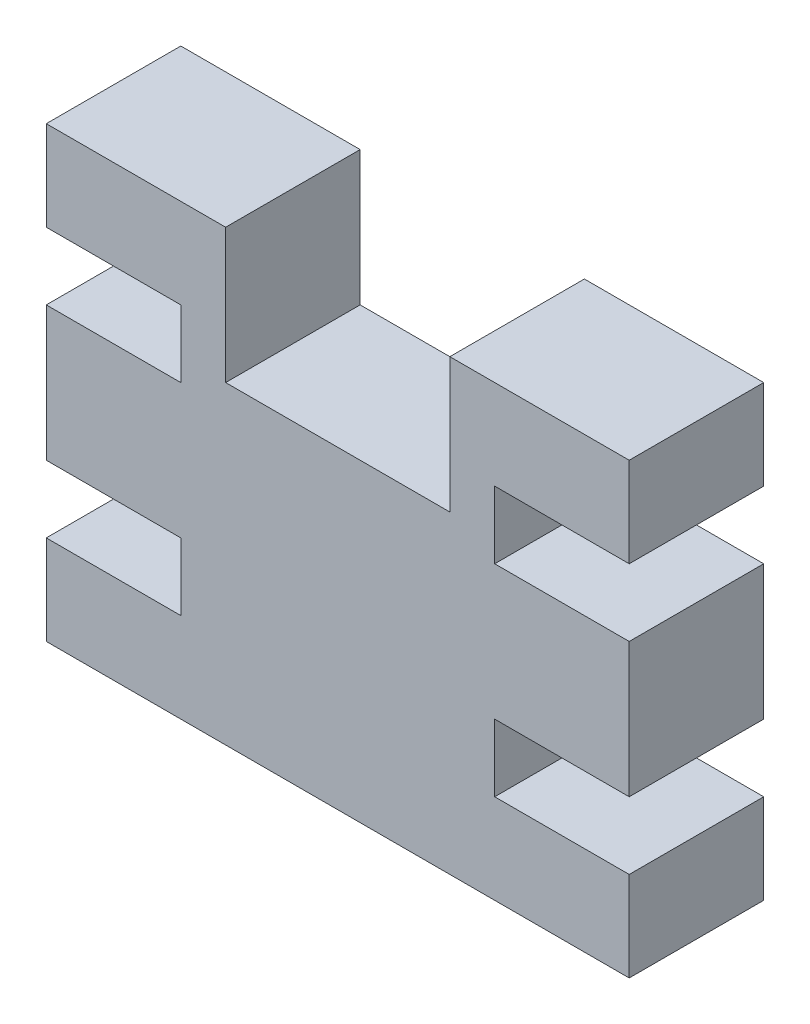
ISO-10303-21;
HEADER;
FILE_DESCRIPTION(('STEP AP214'),'2;1');
FILE_NAME('part.step','',(''),(''),'','','');
FILE_SCHEMA(('AUTOMOTIVE_DESIGN { 1 0 10303 214 1 1 1 1 }'));
ENDSEC;
DATA;
#1=APPLICATION_CONTEXT('core data for automotive mechanical design processes');
#2=APPLICATION_PROTOCOL_DEFINITION('international standard','automotive_design',2000,#1);
#3=PRODUCT_CONTEXT('',#1,'mechanical');
#4=PRODUCT('Part','Part','',(#3));
#5=PRODUCT_RELATED_PRODUCT_CATEGORY('part','',(#4));
#6=PRODUCT_DEFINITION_FORMATION('','',#4);
#7=PRODUCT_DEFINITION_CONTEXT('part definition',#1,'design');
#8=PRODUCT_DEFINITION('design','',#6,#7);
#9=PRODUCT_DEFINITION_SHAPE('','',#8);
#10=(LENGTH_UNIT() NAMED_UNIT(*) SI_UNIT(.MILLI.,.METRE.));
#11=(NAMED_UNIT(*) PLANE_ANGLE_UNIT() SI_UNIT($,.RADIAN.));
#12=(NAMED_UNIT(*) SI_UNIT($,.STERADIAN.) SOLID_ANGLE_UNIT());
#13=UNCERTAINTY_MEASURE_WITH_UNIT(LENGTH_MEASURE(1.E-05),#10,'distance_accuracy_value','');
#14=(GEOMETRIC_REPRESENTATION_CONTEXT(3) GLOBAL_UNCERTAINTY_ASSIGNED_CONTEXT((#13)) GLOBAL_UNIT_ASSIGNED_CONTEXT((#10,
#11,#12)) REPRESENTATION_CONTEXT('',''));
#15=CARTESIAN_POINT('',(0.,0.,0.));
#16=DIRECTION('',(0.,0.,1.));
#17=DIRECTION('',(1.,0.,0.));
#18=AXIS2_PLACEMENT_3D('',#15,#16,#17);
#19=CARTESIAN_POINT('',(6.5,14.6334586466165,3.));
#20=DIRECTION('',(0.,-1.,0.));
#21=DIRECTION('',(0.,0.,-1.));
#22=AXIS2_PLACEMENT_3D('',#19,#20,#21);
#23=PLANE('',#22);
#24=DIRECTION('',(-1.,0.,0.));
#25=VECTOR('',#24,1.);
#26=CARTESIAN_POINT('',(6.5,14.6334586466165,3.));
#27=LINE('',#26,#25);
#28=CARTESIAN_POINT('',(-2.5,14.6334586466165,3.));
#29=VERTEX_POINT('',#28);
#30=CARTESIAN_POINT('',(-6.5,14.6334586466165,3.));
#31=VERTEX_POINT('',#30);
#32=EDGE_CURVE('E348',#29,#31,#27,.T.);
#33=ORIENTED_EDGE('',*,*,#32,.F.);
#34=DIRECTION('',(0.,0.,1.));
#35=VECTOR('',#34,1.);
#36=CARTESIAN_POINT('',(-2.5,14.6334586466165,0.));
#37=LINE('',#36,#35);
#38=CARTESIAN_POINT('',(-2.5,14.6334586466165,0.));
#39=VERTEX_POINT('',#38);
#40=EDGE_CURVE('E228',#39,#29,#37,.T.);
#41=ORIENTED_EDGE('',*,*,#40,.F.);
#42=DIRECTION('',(-1.,0.,0.));
#43=VECTOR('',#42,1.);
#44=CARTESIAN_POINT('',(6.5,14.6334586466165,0.));
#45=LINE('',#44,#43);
#46=CARTESIAN_POINT('',(-6.5,14.6334586466165,0.));
#47=VERTEX_POINT('',#46);
#48=EDGE_CURVE('E219',#39,#47,#45,.T.);
#49=ORIENTED_EDGE('',*,*,#48,.T.);
#50=DIRECTION('',(0.,0.,-1.));
#51=VECTOR('',#50,1.);
#52=CARTESIAN_POINT('',(-6.5,14.6334586466165,3.));
#53=LINE('',#52,#51);
#54=EDGE_CURVE('E353',#31,#47,#53,.T.);
#55=ORIENTED_EDGE('',*,*,#54,.F.);
#56=EDGE_LOOP('',(#33,#41,#49,#55));
#57=FACE_BOUND('',#56,.T.);
#58=ADVANCED_FACE('F38',(#57),#23,.F.);
#59=CARTESIAN_POINT('',(6.5,4.63345864661654,3.));
#60=DIRECTION('',(-1.,0.,0.));
#61=DIRECTION('',(0.,0.,1.));
#62=AXIS2_PLACEMENT_3D('',#59,#60,#61);
#63=PLANE('',#62);
#64=DIRECTION('',(0.,1.,0.));
#65=VECTOR('',#64,1.);
#66=CARTESIAN_POINT('',(6.5,4.63345864661654,0.));
#67=LINE('',#66,#65);
#68=CARTESIAN_POINT('',(6.5,8.13345864661654,0.));
#69=VERTEX_POINT('',#68);
#70=CARTESIAN_POINT('',(6.5,11.1334586466165,0.));
#71=VERTEX_POINT('',#70);
#72=EDGE_CURVE('E364',#69,#71,#67,.T.);
#73=ORIENTED_EDGE('',*,*,#72,.T.);
#74=DIRECTION('',(0.,0.,1.));
#75=VECTOR('',#74,1.);
#76=CARTESIAN_POINT('',(6.5,11.1334586466165,0.));
#77=LINE('',#76,#75);
#78=CARTESIAN_POINT('',(6.5,11.1334586466165,3.));
#79=VERTEX_POINT('',#78);
#80=EDGE_CURVE('E252',#71,#79,#77,.T.);
#81=ORIENTED_EDGE('',*,*,#80,.T.);
#82=DIRECTION('',(0.,1.,0.));
#83=VECTOR('',#82,1.);
#84=CARTESIAN_POINT('',(6.5,4.63345864661654,3.));
#85=LINE('',#84,#83);
#86=CARTESIAN_POINT('',(6.5,8.13345864661654,3.));
#87=VERTEX_POINT('',#86);
#88=EDGE_CURVE('E349',#87,#79,#85,.T.);
#89=ORIENTED_EDGE('',*,*,#88,.F.);
#90=DIRECTION('',(0.,0.,1.));
#91=VECTOR('',#90,1.);
#92=CARTESIAN_POINT('',(6.5,8.13345864661654,0.));
#93=LINE('',#92,#91);
#94=EDGE_CURVE('E261',#69,#87,#93,.T.);
#95=ORIENTED_EDGE('',*,*,#94,.F.);
#96=EDGE_LOOP('',(#73,#81,#89,#95));
#97=FACE_BOUND('',#96,.T.);
#98=ADVANCED_FACE('F437',(#97),#63,.F.);
#99=CARTESIAN_POINT('',(6.5,4.63345864661654,0.));
#100=VERTEX_POINT('',#99);
#101=CARTESIAN_POINT('',(6.5,6.63345864661654,0.));
#102=VERTEX_POINT('',#101);
#103=EDGE_CURVE('E361',#100,#102,#67,.T.);
#104=ORIENTED_EDGE('',*,*,#103,.T.);
#105=DIRECTION('',(0.,0.,1.));
#106=VECTOR('',#105,1.);
#107=CARTESIAN_POINT('',(6.5,6.63345864661654,0.));
#108=LINE('',#107,#106);
#109=CARTESIAN_POINT('',(6.5,6.63345864661654,3.));
#110=VERTEX_POINT('',#109);
#111=EDGE_CURVE('E230',#102,#110,#108,.T.);
#112=ORIENTED_EDGE('',*,*,#111,.T.);
#113=CARTESIAN_POINT('',(6.5,4.63345864661654,3.));
#114=VERTEX_POINT('',#113);
#115=EDGE_CURVE('E345',#114,#110,#85,.T.);
#116=ORIENTED_EDGE('',*,*,#115,.F.);
#117=DIRECTION('',(0.,0.,-1.));
#118=VECTOR('',#117,1.);
#119=CARTESIAN_POINT('',(6.5,4.63345864661654,3.));
#120=LINE('',#119,#118);
#121=EDGE_CURVE('E46',#114,#100,#120,.T.);
#122=ORIENTED_EDGE('',*,*,#121,.T.);
#123=EDGE_LOOP('',(#104,#112,#116,#122));
#124=FACE_BOUND('',#123,.T.);
#125=ADVANCED_FACE('F377',(#124),#63,.F.);
#126=CARTESIAN_POINT('',(-6.5,4.63345864661654,3.));
#127=DIRECTION('',(1.,0.,0.));
#128=DIRECTION('',(0.,0.,-1.));
#129=AXIS2_PLACEMENT_3D('',#126,#127,#128);
#130=PLANE('',#129);
#131=DIRECTION('',(0.,-1.,0.));
#132=VECTOR('',#131,1.);
#133=CARTESIAN_POINT('',(-6.5,4.63345864661654,0.));
#134=LINE('',#133,#132);
#135=CARTESIAN_POINT('',(-6.5,12.6334586466165,0.));
#136=VERTEX_POINT('',#135);
#137=EDGE_CURVE('E354',#47,#136,#134,.T.);
#138=ORIENTED_EDGE('',*,*,#137,.T.);
#139=DIRECTION('',(0.,0.,1.));
#140=VECTOR('',#139,1.);
#141=CARTESIAN_POINT('',(-6.5,12.6334586466165,0.));
#142=LINE('',#141,#140);
#143=CARTESIAN_POINT('',(-6.5,12.6334586466165,3.));
#144=VERTEX_POINT('',#143);
#145=EDGE_CURVE('E304',#136,#144,#142,.T.);
#146=ORIENTED_EDGE('',*,*,#145,.T.);
#147=DIRECTION('',(0.,-1.,0.));
#148=VECTOR('',#147,1.);
#149=CARTESIAN_POINT('',(-6.5,4.63345864661654,3.));
#150=LINE('',#149,#148);
#151=EDGE_CURVE('E337',#31,#144,#150,.T.);
#152=ORIENTED_EDGE('',*,*,#151,.F.);
#153=ORIENTED_EDGE('',*,*,#54,.T.);
#154=EDGE_LOOP('',(#138,#146,#152,#153));
#155=FACE_BOUND('',#154,.T.);
#156=ADVANCED_FACE('F418',(#155),#130,.F.);
#157=CARTESIAN_POINT('',(-6.5,11.1334586466165,3.));
#158=VERTEX_POINT('',#157);
#159=CARTESIAN_POINT('',(-6.5,8.13345864661654,3.));
#160=VERTEX_POINT('',#159);
#161=EDGE_CURVE('E341',#158,#160,#150,.T.);
#162=ORIENTED_EDGE('',*,*,#161,.F.);
#163=DIRECTION('',(0.,0.,1.));
#164=VECTOR('',#163,1.);
#165=CARTESIAN_POINT('',(-6.5,11.1334586466165,0.));
#166=LINE('',#165,#164);
#167=CARTESIAN_POINT('',(-6.5,11.1334586466165,0.));
#168=VERTEX_POINT('',#167);
#169=EDGE_CURVE('E295',#168,#158,#166,.T.);
#170=ORIENTED_EDGE('',*,*,#169,.F.);
#171=CARTESIAN_POINT('',(-6.5,8.13345864661654,0.));
#172=VERTEX_POINT('',#171);
#173=EDGE_CURVE('E358',#168,#172,#134,.T.);
#174=ORIENTED_EDGE('',*,*,#173,.T.);
#175=DIRECTION('',(0.,0.,1.));
#176=VECTOR('',#175,1.);
#177=CARTESIAN_POINT('',(-6.5,8.13345864661654,0.));
#178=LINE('',#177,#176);
#179=EDGE_CURVE('E255',#172,#160,#178,.T.);
#180=ORIENTED_EDGE('',*,*,#179,.T.);
#181=EDGE_LOOP('',(#162,#170,#174,#180));
#182=FACE_BOUND('',#181,.T.);
#183=ADVANCED_FACE('F400',(#182),#130,.F.);
#184=CARTESIAN_POINT('',(-6.5,6.63345864661654,3.));
#185=VERTEX_POINT('',#184);
#186=CARTESIAN_POINT('',(-6.5,4.63345864661654,3.));
#187=VERTEX_POINT('',#186);
#188=EDGE_CURVE('E342',#185,#187,#150,.T.);
#189=ORIENTED_EDGE('',*,*,#188,.F.);
#190=DIRECTION('',(0.,0.,1.));
#191=VECTOR('',#190,1.);
#192=CARTESIAN_POINT('',(-6.5,6.63345864661654,0.));
#193=LINE('',#192,#191);
#194=CARTESIAN_POINT('',(-6.5,6.63345864661654,0.));
#195=VERTEX_POINT('',#194);
#196=EDGE_CURVE('E313',#195,#185,#193,.T.);
#197=ORIENTED_EDGE('',*,*,#196,.F.);
#198=CARTESIAN_POINT('',(-6.5,4.63345864661654,0.));
#199=VERTEX_POINT('',#198);
#200=EDGE_CURVE('E307',#195,#199,#134,.T.);
#201=ORIENTED_EDGE('',*,*,#200,.T.);
#202=DIRECTION('',(0.,0.,-1.));
#203=VECTOR('',#202,1.);
#204=CARTESIAN_POINT('',(-6.5,4.63345864661654,3.));
#205=LINE('',#204,#203);
#206=EDGE_CURVE('E11',#187,#199,#205,.T.);
#207=ORIENTED_EDGE('',*,*,#206,.F.);
#208=EDGE_LOOP('',(#189,#197,#201,#207));
#209=FACE_BOUND('',#208,.T.);
#210=ADVANCED_FACE('F40',(#209),#130,.F.);
#211=CARTESIAN_POINT('',(6.5,4.63345864661654,3.));
#212=DIRECTION('',(0.,1.,0.));
#213=DIRECTION('',(-1.,0.,0.));
#214=AXIS2_PLACEMENT_3D('',#211,#212,#213);
#215=PLANE('',#214);
#216=DIRECTION('',(1.,0.,0.));
#217=VECTOR('',#216,1.);
#218=CARTESIAN_POINT('',(6.5,4.63345864661654,0.));
#219=LINE('',#218,#217);
#220=EDGE_CURVE('E357',#199,#100,#219,.T.);
#221=ORIENTED_EDGE('',*,*,#220,.T.);
#222=ORIENTED_EDGE('',*,*,#121,.F.);
#223=DIRECTION('',(1.,0.,0.));
#224=VECTOR('',#223,1.);
#225=CARTESIAN_POINT('',(6.5,4.63345864661654,3.));
#226=LINE('',#225,#224);
#227=EDGE_CURVE('E340',#187,#114,#226,.T.);
#228=ORIENTED_EDGE('',*,*,#227,.F.);
#229=ORIENTED_EDGE('',*,*,#206,.T.);
#230=EDGE_LOOP('',(#221,#222,#228,#229));
#231=FACE_BOUND('',#230,.T.);
#232=ADVANCED_FACE('F392',(#231),#215,.F.);
#233=CARTESIAN_POINT('',(6.5,12.6334586466165,3.));
#234=VERTEX_POINT('',#233);
#235=CARTESIAN_POINT('',(6.5,14.6334586466165,3.));
#236=VERTEX_POINT('',#235);
#237=EDGE_CURVE('E344',#234,#236,#85,.T.);
#238=ORIENTED_EDGE('',*,*,#237,.F.);
#239=DIRECTION('',(0.,0.,1.));
#240=VECTOR('',#239,1.);
#241=CARTESIAN_POINT('',(6.5,12.6334586466165,0.));
#242=LINE('',#241,#240);
#243=CARTESIAN_POINT('',(6.5,12.6334586466165,0.));
#244=VERTEX_POINT('',#243);
#245=EDGE_CURVE('E243',#244,#234,#242,.T.);
#246=ORIENTED_EDGE('',*,*,#245,.F.);
#247=CARTESIAN_POINT('',(6.5,14.6334586466165,0.));
#248=VERTEX_POINT('',#247);
#249=EDGE_CURVE('E360',#244,#248,#67,.T.);
#250=ORIENTED_EDGE('',*,*,#249,.T.);
#251=DIRECTION('',(0.,0.,-1.));
#252=VECTOR('',#251,1.);
#253=CARTESIAN_POINT('',(6.5,14.6334586466165,3.));
#254=LINE('',#253,#252);
#255=EDGE_CURVE('E370',#236,#248,#254,.T.);
#256=ORIENTED_EDGE('',*,*,#255,.F.);
#257=EDGE_LOOP('',(#238,#246,#250,#256));
#258=FACE_BOUND('',#257,.T.);
#259=ADVANCED_FACE('F448',(#258),#63,.F.);
#260=CARTESIAN_POINT('',(2.5,14.6334586466165,0.));
#261=VERTEX_POINT('',#260);
#262=EDGE_CURVE('E365',#248,#261,#45,.T.);
#263=ORIENTED_EDGE('',*,*,#262,.T.);
#264=DIRECTION('',(0.,0.,1.));
#265=VECTOR('',#264,1.);
#266=CARTESIAN_POINT('',(2.5,14.6334586466165,0.));
#267=LINE('',#266,#265);
#268=CARTESIAN_POINT('',(2.5,14.6334586466165,3.));
#269=VERTEX_POINT('',#268);
#270=EDGE_CURVE('E231',#261,#269,#267,.T.);
#271=ORIENTED_EDGE('',*,*,#270,.T.);
#272=EDGE_CURVE('E350',#236,#269,#27,.T.);
#273=ORIENTED_EDGE('',*,*,#272,.F.);
#274=ORIENTED_EDGE('',*,*,#255,.T.);
#275=EDGE_LOOP('',(#263,#271,#273,#274));
#276=FACE_BOUND('',#275,.T.);
#277=ADVANCED_FACE('F427',(#276),#23,.F.);
#278=CARTESIAN_POINT('',(0.,0.,3.));
#279=DIRECTION('',(0.,0.,1.));
#280=DIRECTION('',(1.,0.,0.));
#281=AXIS2_PLACEMENT_3D('',#278,#279,#280);
#282=PLANE('',#281);
#283=DIRECTION('',(0.,-1.,0.));
#284=VECTOR('',#283,1.);
#285=CARTESIAN_POINT('',(-2.5,14.6334586466165,3.));
#286=LINE('',#285,#284);
#287=CARTESIAN_POINT('',(-2.5,11.6334586466165,3.));
#288=VERTEX_POINT('',#287);
#289=EDGE_CURVE('E205',#29,#288,#286,.T.);
#290=ORIENTED_EDGE('',*,*,#289,.F.);
#291=ORIENTED_EDGE('',*,*,#32,.T.);
#292=ORIENTED_EDGE('',*,*,#151,.T.);
#293=DIRECTION('',(-1.,0.,0.));
#294=VECTOR('',#293,1.);
#295=CARTESIAN_POINT('',(-6.5,12.6334586466165,3.));
#296=LINE('',#295,#294);
#297=CARTESIAN_POINT('',(-3.5,12.6334586466165,3.));
#298=VERTEX_POINT('',#297);
#299=EDGE_CURVE('E289',#298,#144,#296,.T.);
#300=ORIENTED_EDGE('',*,*,#299,.F.);
#301=DIRECTION('',(0.,1.,0.));
#302=VECTOR('',#301,1.);
#303=CARTESIAN_POINT('',(-3.5,12.6334586466165,3.));
#304=LINE('',#303,#302);
#305=CARTESIAN_POINT('',(-3.5,11.1334586466165,3.));
#306=VERTEX_POINT('',#305);
#307=EDGE_CURVE('E299',#306,#298,#304,.T.);
#308=ORIENTED_EDGE('',*,*,#307,.F.);
#309=DIRECTION('',(1.,0.,0.));
#310=VECTOR('',#309,1.);
#311=CARTESIAN_POINT('',(-6.5,11.1334586466165,3.));
#312=LINE('',#311,#310);
#313=EDGE_CURVE('E296',#158,#306,#312,.T.);
#314=ORIENTED_EDGE('',*,*,#313,.F.);
#315=ORIENTED_EDGE('',*,*,#161,.T.);
#316=DIRECTION('',(-1.,0.,0.));
#317=VECTOR('',#316,1.);
#318=CARTESIAN_POINT('',(-6.5,8.13345864661654,3.));
#319=LINE('',#318,#317);
#320=CARTESIAN_POINT('',(-3.5,8.13345864661654,3.));
#321=VERTEX_POINT('',#320);
#322=EDGE_CURVE('E322',#321,#160,#319,.T.);
#323=ORIENTED_EDGE('',*,*,#322,.F.);
#324=DIRECTION('',(0.,1.,0.));
#325=VECTOR('',#324,1.);
#326=CARTESIAN_POINT('',(-3.5,8.13345864661654,3.));
#327=LINE('',#326,#325);
#328=CARTESIAN_POINT('',(-3.5,6.63345864661654,3.));
#329=VERTEX_POINT('',#328);
#330=EDGE_CURVE('E324',#329,#321,#327,.T.);
#331=ORIENTED_EDGE('',*,*,#330,.F.);
#332=DIRECTION('',(1.,0.,0.));
#333=VECTOR('',#332,1.);
#334=CARTESIAN_POINT('',(-6.5,6.63345864661654,3.));
#335=LINE('',#334,#333);
#336=EDGE_CURVE('E300',#185,#329,#335,.T.);
#337=ORIENTED_EDGE('',*,*,#336,.F.);
#338=ORIENTED_EDGE('',*,*,#188,.T.);
#339=ORIENTED_EDGE('',*,*,#227,.T.);
#340=ORIENTED_EDGE('',*,*,#115,.T.);
#341=DIRECTION('',(1.,0.,0.));
#342=VECTOR('',#341,1.);
#343=CARTESIAN_POINT('',(6.5,6.63345864661654,3.));
#344=LINE('',#343,#342);
#345=CARTESIAN_POINT('',(3.5,6.63345864661654,3.));
#346=VERTEX_POINT('',#345);
#347=EDGE_CURVE('E270',#346,#110,#344,.T.);
#348=ORIENTED_EDGE('',*,*,#347,.F.);
#349=DIRECTION('',(0.,-1.,0.));
#350=VECTOR('',#349,1.);
#351=CARTESIAN_POINT('',(3.5,8.13345864661654,3.));
#352=LINE('',#351,#350);
#353=CARTESIAN_POINT('',(3.5,8.13345864661654,3.));
#354=VERTEX_POINT('',#353);
#355=EDGE_CURVE('E272',#354,#346,#352,.T.);
#356=ORIENTED_EDGE('',*,*,#355,.F.);
#357=DIRECTION('',(-1.,0.,0.));
#358=VECTOR('',#357,1.);
#359=CARTESIAN_POINT('',(6.5,8.13345864661654,3.));
#360=LINE('',#359,#358);
#361=EDGE_CURVE('E248',#87,#354,#360,.T.);
#362=ORIENTED_EDGE('',*,*,#361,.F.);
#363=ORIENTED_EDGE('',*,*,#88,.T.);
#364=DIRECTION('',(1.,0.,0.));
#365=VECTOR('',#364,1.);
#366=CARTESIAN_POINT('',(6.5,11.1334586466165,3.));
#367=LINE('',#366,#365);
#368=CARTESIAN_POINT('',(3.5,11.1334586466165,3.));
#369=VERTEX_POINT('',#368);
#370=EDGE_CURVE('E238',#369,#79,#367,.T.);
#371=ORIENTED_EDGE('',*,*,#370,.F.);
#372=DIRECTION('',(0.,-1.,0.));
#373=VECTOR('',#372,1.);
#374=CARTESIAN_POINT('',(3.5,12.6334586466165,3.));
#375=LINE('',#374,#373);
#376=CARTESIAN_POINT('',(3.5,12.6334586466165,3.));
#377=VERTEX_POINT('',#376);
#378=EDGE_CURVE('E247',#377,#369,#375,.T.);
#379=ORIENTED_EDGE('',*,*,#378,.F.);
#380=DIRECTION('',(-1.,0.,0.));
#381=VECTOR('',#380,1.);
#382=CARTESIAN_POINT('',(6.5,12.6334586466165,3.));
#383=LINE('',#382,#381);
#384=EDGE_CURVE('E244',#234,#377,#383,.T.);
#385=ORIENTED_EDGE('',*,*,#384,.F.);
#386=ORIENTED_EDGE('',*,*,#237,.T.);
#387=ORIENTED_EDGE('',*,*,#272,.T.);
#388=DIRECTION('',(0.,1.,0.));
#389=VECTOR('',#388,1.);
#390=CARTESIAN_POINT('',(2.5,14.6334586466165,3.));
#391=LINE('',#390,#389);
#392=CARTESIAN_POINT('',(2.5,11.6334586466165,3.));
#393=VERTEX_POINT('',#392);
#394=EDGE_CURVE('E220',#393,#269,#391,.T.);
#395=ORIENTED_EDGE('',*,*,#394,.F.);
#396=DIRECTION('',(1.,0.,0.));
#397=VECTOR('',#396,1.);
#398=CARTESIAN_POINT('',(-2.5,11.6334586466165,3.));
#399=LINE('',#398,#397);
#400=EDGE_CURVE('E222',#288,#393,#399,.T.);
#401=ORIENTED_EDGE('',*,*,#400,.F.);
#402=EDGE_LOOP('',(#290,#291,#292,#300,#308,#314,#315,#323,#331,#337,#338,#339,#340,#348,#356,
#362,#363,#371,#379,#385,#386,#387,#395,#401));
#403=FACE_BOUND('',#402,.T.);
#404=ADVANCED_FACE('F387',(#403),#282,.T.);
#405=CARTESIAN_POINT('',(0.,0.,0.));
#406=DIRECTION('',(0.,0.,1.));
#407=DIRECTION('',(1.,0.,0.));
#408=AXIS2_PLACEMENT_3D('',#405,#406,#407);
#409=PLANE('',#408);
#410=ORIENTED_EDGE('',*,*,#48,.F.);
#411=DIRECTION('',(0.,-1.,0.));
#412=VECTOR('',#411,1.);
#413=CARTESIAN_POINT('',(-2.5,14.6334586466165,0.));
#414=LINE('',#413,#412);
#415=CARTESIAN_POINT('',(-2.5,11.6334586466165,0.));
#416=VERTEX_POINT('',#415);
#417=EDGE_CURVE('E202',#39,#416,#414,.T.);
#418=ORIENTED_EDGE('',*,*,#417,.T.);
#419=DIRECTION('',(1.,0.,0.));
#420=VECTOR('',#419,1.);
#421=CARTESIAN_POINT('',(-2.5,11.6334586466165,0.));
#422=LINE('',#421,#420);
#423=CARTESIAN_POINT('',(2.5,11.6334586466165,0.));
#424=VERTEX_POINT('',#423);
#425=EDGE_CURVE('E212',#416,#424,#422,.T.);
#426=ORIENTED_EDGE('',*,*,#425,.T.);
#427=DIRECTION('',(0.,1.,0.));
#428=VECTOR('',#427,1.);
#429=CARTESIAN_POINT('',(2.5,14.6334586466165,0.));
#430=LINE('',#429,#428);
#431=EDGE_CURVE('E53',#424,#261,#430,.T.);
#432=ORIENTED_EDGE('',*,*,#431,.T.);
#433=ORIENTED_EDGE('',*,*,#262,.F.);
#434=ORIENTED_EDGE('',*,*,#249,.F.);
#435=DIRECTION('',(-1.,0.,0.));
#436=VECTOR('',#435,1.);
#437=CARTESIAN_POINT('',(6.5,12.6334586466165,0.));
#438=LINE('',#437,#436);
#439=CARTESIAN_POINT('',(3.5,12.6334586466165,0.));
#440=VERTEX_POINT('',#439);
#441=EDGE_CURVE('E235',#244,#440,#438,.T.);
#442=ORIENTED_EDGE('',*,*,#441,.T.);
#443=DIRECTION('',(0.,-1.,0.));
#444=VECTOR('',#443,1.);
#445=CARTESIAN_POINT('',(3.5,12.6334586466165,0.));
#446=LINE('',#445,#444);
#447=CARTESIAN_POINT('',(3.5,11.1334586466165,0.));
#448=VERTEX_POINT('',#447);
#449=EDGE_CURVE('E61',#440,#448,#446,.T.);
#450=ORIENTED_EDGE('',*,*,#449,.T.);
#451=DIRECTION('',(1.,0.,0.));
#452=VECTOR('',#451,1.);
#453=CARTESIAN_POINT('',(6.5,11.1334586466165,0.));
#454=LINE('',#453,#452);
#455=EDGE_CURVE('E240',#448,#71,#454,.T.);
#456=ORIENTED_EDGE('',*,*,#455,.T.);
#457=ORIENTED_EDGE('',*,*,#72,.F.);
#458=DIRECTION('',(-1.,0.,0.));
#459=VECTOR('',#458,1.);
#460=CARTESIAN_POINT('',(6.5,8.13345864661654,0.));
#461=LINE('',#460,#459);
#462=CARTESIAN_POINT('',(3.5,8.13345864661654,0.));
#463=VERTEX_POINT('',#462);
#464=EDGE_CURVE('E273',#69,#463,#461,.T.);
#465=ORIENTED_EDGE('',*,*,#464,.T.);
#466=DIRECTION('',(0.,-1.,0.));
#467=VECTOR('',#466,1.);
#468=CARTESIAN_POINT('',(3.5,8.13345864661654,0.));
#469=LINE('',#468,#467);
#470=CARTESIAN_POINT('',(3.5,6.63345864661654,0.));
#471=VERTEX_POINT('',#470);
#472=EDGE_CURVE('E280',#463,#471,#469,.T.);
#473=ORIENTED_EDGE('',*,*,#472,.T.);
#474=DIRECTION('',(1.,0.,0.));
#475=VECTOR('',#474,1.);
#476=CARTESIAN_POINT('',(6.5,6.63345864661654,0.));
#477=LINE('',#476,#475);
#478=EDGE_CURVE('E263',#471,#102,#477,.T.);
#479=ORIENTED_EDGE('',*,*,#478,.T.);
#480=ORIENTED_EDGE('',*,*,#103,.F.);
#481=ORIENTED_EDGE('',*,*,#220,.F.);
#482=ORIENTED_EDGE('',*,*,#200,.F.);
#483=DIRECTION('',(1.,0.,0.));
#484=VECTOR('',#483,1.);
#485=CARTESIAN_POINT('',(-6.5,6.63345864661654,0.));
#486=LINE('',#485,#484);
#487=CARTESIAN_POINT('',(-3.5,6.63345864661654,0.));
#488=VERTEX_POINT('',#487);
#489=EDGE_CURVE('E325',#195,#488,#486,.T.);
#490=ORIENTED_EDGE('',*,*,#489,.T.);
#491=DIRECTION('',(0.,1.,0.));
#492=VECTOR('',#491,1.);
#493=CARTESIAN_POINT('',(-3.5,8.13345864661654,0.));
#494=LINE('',#493,#492);
#495=CARTESIAN_POINT('',(-3.5,8.13345864661654,0.));
#496=VERTEX_POINT('',#495);
#497=EDGE_CURVE('E332',#488,#496,#494,.T.);
#498=ORIENTED_EDGE('',*,*,#497,.T.);
#499=DIRECTION('',(-1.,0.,0.));
#500=VECTOR('',#499,1.);
#501=CARTESIAN_POINT('',(-6.5,8.13345864661654,0.));
#502=LINE('',#501,#500);
#503=EDGE_CURVE('E315',#496,#172,#502,.T.);
#504=ORIENTED_EDGE('',*,*,#503,.T.);
#505=ORIENTED_EDGE('',*,*,#173,.F.);
#506=DIRECTION('',(1.,0.,0.));
#507=VECTOR('',#506,1.);
#508=CARTESIAN_POINT('',(-6.5,11.1334586466165,0.));
#509=LINE('',#508,#507);
#510=CARTESIAN_POINT('',(-3.5,11.1334586466165,0.));
#511=VERTEX_POINT('',#510);
#512=EDGE_CURVE('E285',#168,#511,#509,.T.);
#513=ORIENTED_EDGE('',*,*,#512,.T.);
#514=DIRECTION('',(0.,1.,0.));
#515=VECTOR('',#514,1.);
#516=CARTESIAN_POINT('',(-3.5,12.6334586466165,0.));
#517=LINE('',#516,#515);
#518=CARTESIAN_POINT('',(-3.5,12.6334586466165,0.));
#519=VERTEX_POINT('',#518);
#520=EDGE_CURVE('E288',#511,#519,#517,.T.);
#521=ORIENTED_EDGE('',*,*,#520,.T.);
#522=DIRECTION('',(-1.,0.,0.));
#523=VECTOR('',#522,1.);
#524=CARTESIAN_POINT('',(-6.5,12.6334586466165,0.));
#525=LINE('',#524,#523);
#526=EDGE_CURVE('E292',#519,#136,#525,.T.);
#527=ORIENTED_EDGE('',*,*,#526,.T.);
#528=ORIENTED_EDGE('',*,*,#137,.F.);
#529=EDGE_LOOP('',(#410,#418,#426,#432,#433,#434,#442,#450,#456,#457,#465,#473,#479,#480,#481,
#482,#490,#498,#504,#505,#513,#521,#527,#528));
#530=FACE_BOUND('',#529,.T.);
#531=ADVANCED_FACE('F217',(#530),#409,.F.);
#532=CARTESIAN_POINT('',(-6.5,8.13345864661654,0.));
#533=DIRECTION('',(0.,1.,0.));
#534=DIRECTION('',(0.,0.,1.));
#535=AXIS2_PLACEMENT_3D('',#532,#533,#534);
#536=PLANE('',#535);
#537=ORIENTED_EDGE('',*,*,#322,.T.);
#538=ORIENTED_EDGE('',*,*,#179,.F.);
#539=ORIENTED_EDGE('',*,*,#503,.F.);
#540=DIRECTION('',(0.,0.,1.));
#541=VECTOR('',#540,1.);
#542=CARTESIAN_POINT('',(-3.5,8.13345864661654,0.));
#543=LINE('',#542,#541);
#544=EDGE_CURVE('E318',#496,#321,#543,.T.);
#545=ORIENTED_EDGE('',*,*,#544,.T.);
#546=EDGE_LOOP('',(#537,#538,#539,#545));
#547=FACE_BOUND('',#546,.T.);
#548=ADVANCED_FACE('F404',(#547),#536,.F.);
#549=CARTESIAN_POINT('',(-3.5,8.13345864661654,0.));
#550=DIRECTION('',(1.,0.,0.));
#551=DIRECTION('',(0.,1.,0.));
#552=AXIS2_PLACEMENT_3D('',#549,#550,#551);
#553=PLANE('',#552);
#554=ORIENTED_EDGE('',*,*,#330,.T.);
#555=ORIENTED_EDGE('',*,*,#544,.F.);
#556=ORIENTED_EDGE('',*,*,#497,.F.);
#557=DIRECTION('',(0.,0.,1.));
#558=VECTOR('',#557,1.);
#559=CARTESIAN_POINT('',(-3.5,6.63345864661654,0.));
#560=LINE('',#559,#558);
#561=EDGE_CURVE('E316',#488,#329,#560,.T.);
#562=ORIENTED_EDGE('',*,*,#561,.T.);
#563=EDGE_LOOP('',(#554,#555,#556,#562));
#564=FACE_BOUND('',#563,.T.);
#565=ADVANCED_FACE('F470',(#564),#553,.F.);
#566=CARTESIAN_POINT('',(-6.5,6.63345864661654,0.));
#567=DIRECTION('',(0.,-1.,0.));
#568=DIRECTION('',(0.,0.,-1.));
#569=AXIS2_PLACEMENT_3D('',#566,#567,#568);
#570=PLANE('',#569);
#571=ORIENTED_EDGE('',*,*,#336,.T.);
#572=ORIENTED_EDGE('',*,*,#561,.F.);
#573=ORIENTED_EDGE('',*,*,#489,.F.);
#574=ORIENTED_EDGE('',*,*,#196,.T.);
#575=EDGE_LOOP('',(#571,#572,#573,#574));
#576=FACE_BOUND('',#575,.T.);
#577=ADVANCED_FACE('F473',(#576),#570,.F.);
#578=CARTESIAN_POINT('',(-6.5,12.6334586466165,0.));
#579=DIRECTION('',(0.,1.,0.));
#580=DIRECTION('',(0.,0.,1.));
#581=AXIS2_PLACEMENT_3D('',#578,#579,#580);
#582=PLANE('',#581);
#583=ORIENTED_EDGE('',*,*,#299,.T.);
#584=ORIENTED_EDGE('',*,*,#145,.F.);
#585=ORIENTED_EDGE('',*,*,#526,.F.);
#586=DIRECTION('',(0.,0.,1.));
#587=VECTOR('',#586,1.);
#588=CARTESIAN_POINT('',(-3.5,12.6334586466165,0.));
#589=LINE('',#588,#587);
#590=EDGE_CURVE('E308',#519,#298,#589,.T.);
#591=ORIENTED_EDGE('',*,*,#590,.T.);
#592=EDGE_LOOP('',(#583,#584,#585,#591));
#593=FACE_BOUND('',#592,.T.);
#594=ADVANCED_FACE('F477',(#593),#582,.F.);
#595=CARTESIAN_POINT('',(-3.5,12.6334586466165,0.));
#596=DIRECTION('',(1.,0.,0.));
#597=DIRECTION('',(0.,0.,-1.));
#598=AXIS2_PLACEMENT_3D('',#595,#596,#597);
#599=PLANE('',#598);
#600=ORIENTED_EDGE('',*,*,#307,.T.);
#601=ORIENTED_EDGE('',*,*,#590,.F.);
#602=ORIENTED_EDGE('',*,*,#520,.F.);
#603=DIRECTION('',(0.,0.,1.));
#604=VECTOR('',#603,1.);
#605=CARTESIAN_POINT('',(-3.5,11.1334586466165,0.));
#606=LINE('',#605,#604);
#607=EDGE_CURVE('E310',#511,#306,#606,.T.);
#608=ORIENTED_EDGE('',*,*,#607,.T.);
#609=EDGE_LOOP('',(#600,#601,#602,#608));
#610=FACE_BOUND('',#609,.T.);
#611=ADVANCED_FACE('F414',(#610),#599,.F.);
#612=CARTESIAN_POINT('',(-6.5,11.1334586466165,0.));
#613=DIRECTION('',(0.,-1.,0.));
#614=DIRECTION('',(0.,0.,-1.));
#615=AXIS2_PLACEMENT_3D('',#612,#613,#614);
#616=PLANE('',#615);
#617=ORIENTED_EDGE('',*,*,#313,.T.);
#618=ORIENTED_EDGE('',*,*,#607,.F.);
#619=ORIENTED_EDGE('',*,*,#512,.F.);
#620=ORIENTED_EDGE('',*,*,#169,.T.);
#621=EDGE_LOOP('',(#617,#618,#619,#620));
#622=FACE_BOUND('',#621,.T.);
#623=ADVANCED_FACE('F412',(#622),#616,.F.);
#624=CARTESIAN_POINT('',(6.5,6.63345864661654,0.));
#625=DIRECTION('',(0.,-1.,0.));
#626=DIRECTION('',(1.,0.,0.));
#627=AXIS2_PLACEMENT_3D('',#624,#625,#626);
#628=PLANE('',#627);
#629=ORIENTED_EDGE('',*,*,#347,.T.);
#630=ORIENTED_EDGE('',*,*,#111,.F.);
#631=ORIENTED_EDGE('',*,*,#478,.F.);
#632=DIRECTION('',(0.,0.,1.));
#633=VECTOR('',#632,1.);
#634=CARTESIAN_POINT('',(3.5,6.63345864661654,0.));
#635=LINE('',#634,#633);
#636=EDGE_CURVE('E266',#471,#346,#635,.T.);
#637=ORIENTED_EDGE('',*,*,#636,.T.);
#638=EDGE_LOOP('',(#629,#630,#631,#637));
#639=FACE_BOUND('',#638,.T.);
#640=ADVANCED_FACE('F384',(#639),#628,.F.);
#641=CARTESIAN_POINT('',(3.5,8.13345864661654,0.));
#642=DIRECTION('',(-1.,0.,0.));
#643=DIRECTION('',(0.,-1.,0.));
#644=AXIS2_PLACEMENT_3D('',#641,#642,#643);
#645=PLANE('',#644);
#646=ORIENTED_EDGE('',*,*,#355,.T.);
#647=ORIENTED_EDGE('',*,*,#636,.F.);
#648=ORIENTED_EDGE('',*,*,#472,.F.);
#649=DIRECTION('',(0.,0.,1.));
#650=VECTOR('',#649,1.);
#651=CARTESIAN_POINT('',(3.5,8.13345864661654,0.));
#652=LINE('',#651,#650);
#653=EDGE_CURVE('E264',#463,#354,#652,.T.);
#654=ORIENTED_EDGE('',*,*,#653,.T.);
#655=EDGE_LOOP('',(#646,#647,#648,#654));
#656=FACE_BOUND('',#655,.T.);
#657=ADVANCED_FACE('F486',(#656),#645,.F.);
#658=CARTESIAN_POINT('',(6.5,8.13345864661654,0.));
#659=DIRECTION('',(0.,1.,0.));
#660=DIRECTION('',(0.,0.,1.));
#661=AXIS2_PLACEMENT_3D('',#658,#659,#660);
#662=PLANE('',#661);
#663=ORIENTED_EDGE('',*,*,#361,.T.);
#664=ORIENTED_EDGE('',*,*,#653,.F.);
#665=ORIENTED_EDGE('',*,*,#464,.F.);
#666=ORIENTED_EDGE('',*,*,#94,.T.);
#667=EDGE_LOOP('',(#663,#664,#665,#666));
#668=FACE_BOUND('',#667,.T.);
#669=ADVANCED_FACE('F489',(#668),#662,.F.);
#670=CARTESIAN_POINT('',(6.5,11.1334586466165,0.));
#671=DIRECTION('',(0.,-1.,0.));
#672=DIRECTION('',(1.,0.,0.));
#673=AXIS2_PLACEMENT_3D('',#670,#671,#672);
#674=PLANE('',#673);
#675=ORIENTED_EDGE('',*,*,#370,.T.);
#676=ORIENTED_EDGE('',*,*,#80,.F.);
#677=ORIENTED_EDGE('',*,*,#455,.F.);
#678=DIRECTION('',(0.,0.,1.));
#679=VECTOR('',#678,1.);
#680=CARTESIAN_POINT('',(3.5,11.1334586466165,0.));
#681=LINE('',#680,#679);
#682=EDGE_CURVE('E256',#448,#369,#681,.T.);
#683=ORIENTED_EDGE('',*,*,#682,.T.);
#684=EDGE_LOOP('',(#675,#676,#677,#683));
#685=FACE_BOUND('',#684,.T.);
#686=ADVANCED_FACE('F442',(#685),#674,.F.);
#687=CARTESIAN_POINT('',(3.5,12.6334586466165,0.));
#688=DIRECTION('',(-1.,0.,0.));
#689=DIRECTION('',(0.,0.,1.));
#690=AXIS2_PLACEMENT_3D('',#687,#688,#689);
#691=PLANE('',#690);
#692=ORIENTED_EDGE('',*,*,#378,.T.);
#693=ORIENTED_EDGE('',*,*,#682,.F.);
#694=ORIENTED_EDGE('',*,*,#449,.F.);
#695=DIRECTION('',(0.,0.,1.));
#696=VECTOR('',#695,1.);
#697=CARTESIAN_POINT('',(3.5,12.6334586466165,0.));
#698=LINE('',#697,#696);
#699=EDGE_CURVE('E258',#440,#377,#698,.T.);
#700=ORIENTED_EDGE('',*,*,#699,.T.);
#701=EDGE_LOOP('',(#692,#693,#694,#700));
#702=FACE_BOUND('',#701,.T.);
#703=ADVANCED_FACE('F496',(#702),#691,.F.);
#704=CARTESIAN_POINT('',(6.5,12.6334586466165,0.));
#705=DIRECTION('',(0.,1.,0.));
#706=DIRECTION('',(0.,0.,1.));
#707=AXIS2_PLACEMENT_3D('',#704,#705,#706);
#708=PLANE('',#707);
#709=ORIENTED_EDGE('',*,*,#384,.T.);
#710=ORIENTED_EDGE('',*,*,#699,.F.);
#711=ORIENTED_EDGE('',*,*,#441,.F.);
#712=ORIENTED_EDGE('',*,*,#245,.T.);
#713=EDGE_LOOP('',(#709,#710,#711,#712));
#714=FACE_BOUND('',#713,.T.);
#715=ADVANCED_FACE('F494',(#714),#708,.F.);
#716=CARTESIAN_POINT('',(-2.5,14.6334586466165,0.));
#717=DIRECTION('',(-1.,0.,0.));
#718=DIRECTION('',(0.,-1.,0.));
#719=AXIS2_PLACEMENT_3D('',#716,#717,#718);
#720=PLANE('',#719);
#721=ORIENTED_EDGE('',*,*,#289,.T.);
#722=DIRECTION('',(0.,0.,1.));
#723=VECTOR('',#722,1.);
#724=CARTESIAN_POINT('',(-2.5,11.6334586466165,0.));
#725=LINE('',#724,#723);
#726=EDGE_CURVE('E198',#416,#288,#725,.T.);
#727=ORIENTED_EDGE('',*,*,#726,.F.);
#728=ORIENTED_EDGE('',*,*,#417,.F.);
#729=ORIENTED_EDGE('',*,*,#40,.T.);
#730=EDGE_LOOP('',(#721,#727,#728,#729));
#731=FACE_BOUND('',#730,.T.);
#732=ADVANCED_FACE('F200',(#731),#720,.F.);
#733=CARTESIAN_POINT('',(2.5,14.6334586466165,0.));
#734=DIRECTION('',(1.,0.,0.));
#735=DIRECTION('',(0.,0.,-1.));
#736=AXIS2_PLACEMENT_3D('',#733,#734,#735);
#737=PLANE('',#736);
#738=ORIENTED_EDGE('',*,*,#394,.T.);
#739=ORIENTED_EDGE('',*,*,#270,.F.);
#740=ORIENTED_EDGE('',*,*,#431,.F.);
#741=DIRECTION('',(0.,0.,1.));
#742=VECTOR('',#741,1.);
#743=CARTESIAN_POINT('',(2.5,11.6334586466165,0.));
#744=LINE('',#743,#742);
#745=EDGE_CURVE('E209',#424,#393,#744,.T.);
#746=ORIENTED_EDGE('',*,*,#745,.T.);
#747=EDGE_LOOP('',(#738,#739,#740,#746));
#748=FACE_BOUND('',#747,.T.);
#749=ADVANCED_FACE('F425',(#748),#737,.F.);
#750=CARTESIAN_POINT('',(-2.5,11.6334586466165,0.));
#751=DIRECTION('',(0.,-1.,0.));
#752=DIRECTION('',(0.,0.,-1.));
#753=AXIS2_PLACEMENT_3D('',#750,#751,#752);
#754=PLANE('',#753);
#755=ORIENTED_EDGE('',*,*,#400,.T.);
#756=ORIENTED_EDGE('',*,*,#745,.F.);
#757=ORIENTED_EDGE('',*,*,#425,.F.);
#758=ORIENTED_EDGE('',*,*,#726,.T.);
#759=EDGE_LOOP('',(#755,#756,#757,#758));
#760=FACE_BOUND('',#759,.T.);
#761=ADVANCED_FACE('F213',(#760),#754,.F.);
#762=CLOSED_SHELL('',(#58,#98,#125,#156,#183,#210,#232,#259,#277,#404,#531,#548,#565,#577,#594,
#611,#623,#640,#657,#669,#686,#703,#715,#732,#749,#761));
#763=MANIFOLD_SOLID_BREP('B2',#762);
#764=ADVANCED_BREP_SHAPE_REPRESENTATION('',(#18,#763),#14);
#765=SHAPE_DEFINITION_REPRESENTATION(#9,#764);
ENDSEC;
END-ISO-10303-21;
